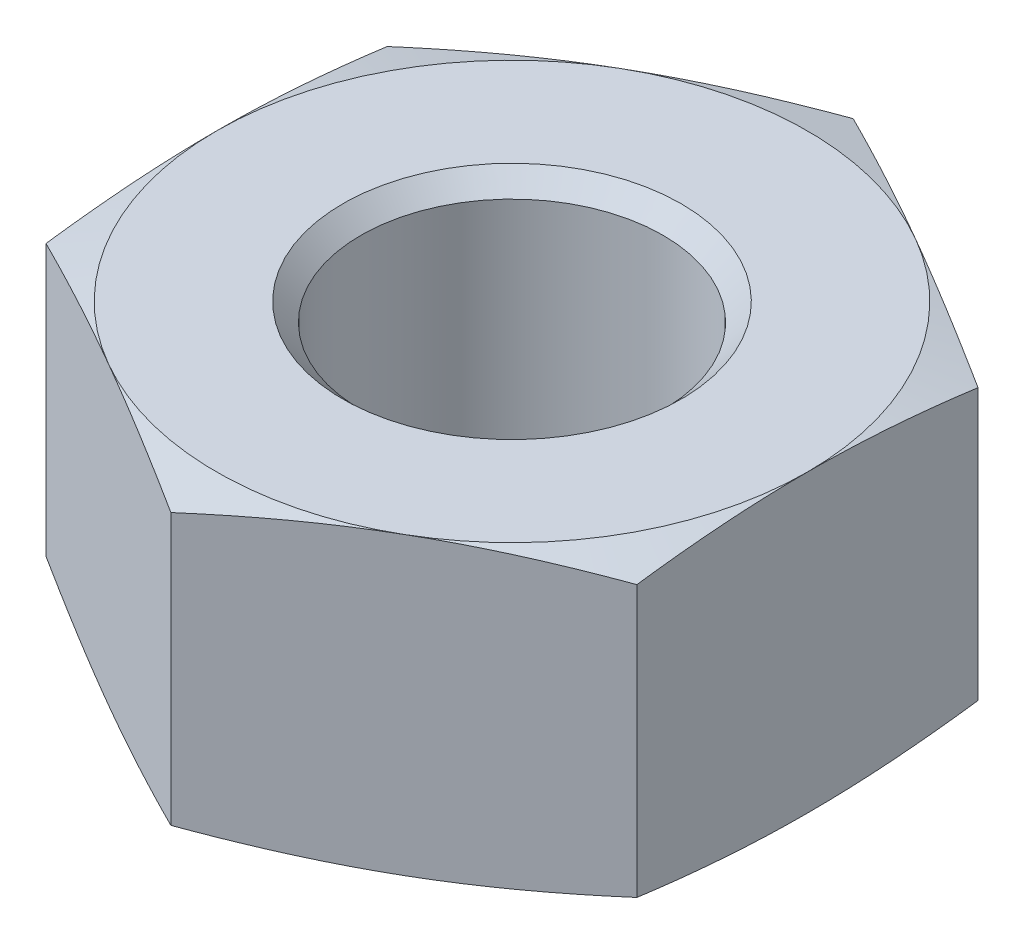
ISO-10303-21;
HEADER;
FILE_DESCRIPTION(('STEP AP214'),'2;1');
FILE_NAME('part.step','',(''),(''),'','','');
FILE_SCHEMA(('AUTOMOTIVE_DESIGN { 1 0 10303 214 1 1 1 1 }'));
ENDSEC;
DATA;
#1=APPLICATION_CONTEXT('core data for automotive mechanical design processes');
#2=APPLICATION_PROTOCOL_DEFINITION('international standard','automotive_design',2000,#1);
#3=PRODUCT_CONTEXT('',#1,'mechanical');
#4=PRODUCT('Part','Part','',(#3));
#5=PRODUCT_RELATED_PRODUCT_CATEGORY('part','',(#4));
#6=PRODUCT_DEFINITION_FORMATION('','',#4);
#7=PRODUCT_DEFINITION_CONTEXT('part definition',#1,'design');
#8=PRODUCT_DEFINITION('design','',#6,#7);
#9=PRODUCT_DEFINITION_SHAPE('','',#8);
#10=(LENGTH_UNIT() NAMED_UNIT(*) SI_UNIT(.MILLI.,.METRE.));
#11=(NAMED_UNIT(*) PLANE_ANGLE_UNIT() SI_UNIT($,.RADIAN.));
#12=(NAMED_UNIT(*) SI_UNIT($,.STERADIAN.) SOLID_ANGLE_UNIT());
#13=UNCERTAINTY_MEASURE_WITH_UNIT(LENGTH_MEASURE(1.E-05),#10,'distance_accuracy_value','');
#14=(GEOMETRIC_REPRESENTATION_CONTEXT(3) GLOBAL_UNCERTAINTY_ASSIGNED_CONTEXT((#13)) GLOBAL_UNIT_ASSIGNED_CONTEXT((#10,
#11,#12)) REPRESENTATION_CONTEXT('',''));
#15=CARTESIAN_POINT('',(0.,0.,0.));
#16=DIRECTION('',(0.,0.,1.));
#17=DIRECTION('',(1.,0.,0.));
#18=AXIS2_PLACEMENT_3D('',#15,#16,#17);
#19=CARTESIAN_POINT('',(-6.5,6.5,-3.7527767497326));
#20=DIRECTION('',(1.,0.,0.));
#21=DIRECTION('',(0.,0.,-1.));
#22=AXIS2_PLACEMENT_3D('',#19,#20,#21);
#23=PLANE('',#22);
#24=DIRECTION('',(0.,-1.,0.));
#25=VECTOR('',#24,1.);
#26=CARTESIAN_POINT('',(-6.5,6.23056275187204,-3.7527767497326));
#27=LINE('',#26,#25);
#28=CARTESIAN_POINT('',(-6.5,6.23056275187204,-3.7527767497326));
#29=VERTEX_POINT('',#28);
#30=CARTESIAN_POINT('',(-6.5,0.269437248127976,-3.7527767497326));
#31=VERTEX_POINT('',#30);
#32=EDGE_CURVE('E118',#29,#31,#27,.T.);
#33=ORIENTED_EDGE('',*,*,#32,.T.);
#34=CARTESIAN_POINT('',(-6.5,0.269437247496808,-3.75277674502149));
#35=CARTESIAN_POINT('',(-6.5,0.186247582676988,-3.13184063289249));
#36=CARTESIAN_POINT('',(-6.5,0.118430458271947,-2.51052770723897));
#37=CARTESIAN_POINT('',(-6.5,0.0250099618368206,-1.25843438548893));
#38=CARTESIAN_POINT('',(-6.5,1.60932633538891E-07,-0.629074333512159));
#39=CARTESIAN_POINT('',(-6.5,7.92768628521401E-13,-6.2059061175547E-06));
#40=B_SPLINE_CURVE_WITH_KNOTS('',3,(#34,#35,#36,#37,#38,#39),.UNSPECIFIED.,.F.,.F.,(4,2,4),
(7.68274920144655,9.56079556300664,11.4388419245667),.UNSPECIFIED.);
#41=CARTESIAN_POINT('',(-6.5,0.,0.));
#42=VERTEX_POINT('',#41);
#43=EDGE_CURVE('E106',#31,#42,#40,.T.);
#44=ORIENTED_EDGE('',*,*,#43,.T.);
#45=CARTESIAN_POINT('',(-6.5,7.92768628521401E-13,-6.2059061175547E-06));
#46=CARTESIAN_POINT('',(-6.5,-1.64350637266164E-07,0.642428790685808));
#47=CARTESIAN_POINT('',(-6.5,0.0258917321915124,1.28237667353398));
#48=CARTESIAN_POINT('',(-6.5,0.12112865915791,2.53441211538354));
#49=CARTESIAN_POINT('',(-6.5,0.188020683808513,3.14507520983443));
#50=CARTESIAN_POINT('',(-6.5,0.269437214303708,3.75277649726482));
#51=B_SPLINE_CURVE_WITH_KNOTS('',3,(#45,#46,#47,#48,#49,#50),.UNSPECIFIED.,.F.,.F.,(4,2,4),
(11.4388419245667,13.3393255442372,15.145068658514),.UNSPECIFIED.);
#52=CARTESIAN_POINT('',(-6.5,0.269437248127976,3.7527767497326));
#53=VERTEX_POINT('',#52);
#54=EDGE_CURVE('E119',#42,#53,#51,.T.);
#55=ORIENTED_EDGE('',*,*,#54,.T.);
#56=DIRECTION('',(0.,-1.,0.));
#57=VECTOR('',#56,1.);
#58=CARTESIAN_POINT('',(-6.5,6.23056275187204,3.7527767497326));
#59=LINE('',#58,#57);
#60=CARTESIAN_POINT('',(-6.5,6.23056275187204,3.7527767497326));
#61=VERTEX_POINT('',#60);
#62=EDGE_CURVE('E178',#61,#53,#59,.T.);
#63=ORIENTED_EDGE('',*,*,#62,.F.);
#64=CARTESIAN_POINT('',(-6.5,6.23056275250321,3.75277674502149));
#65=CARTESIAN_POINT('',(-6.5,6.31375241732302,3.13184063289249));
#66=CARTESIAN_POINT('',(-6.5,6.38156954172806,2.51052770723897));
#67=CARTESIAN_POINT('',(-6.5,6.47499003816318,1.25843438548892));
#68=CARTESIAN_POINT('',(-6.5,6.49999983906737,0.629074333512159));
#69=CARTESIAN_POINT('',(-6.5,6.49999999999921,6.2059061175547E-06));
#70=B_SPLINE_CURVE_WITH_KNOTS('',3,(#64,#65,#66,#67,#68,#69),.UNSPECIFIED.,.F.,.F.,(4,2,4),
(7.68274920144654,9.56079556300663,11.4388419245667),.UNSPECIFIED.);
#71=CARTESIAN_POINT('',(-6.5,6.5,0.));
#72=VERTEX_POINT('',#71);
#73=EDGE_CURVE('E179',#61,#72,#70,.T.);
#74=ORIENTED_EDGE('',*,*,#73,.T.);
#75=CARTESIAN_POINT('',(-6.5,6.49999999999921,6.2059061175547E-06));
#76=CARTESIAN_POINT('',(-6.5,6.50000016435064,-0.6424287906858));
#77=CARTESIAN_POINT('',(-6.5,6.47410826780849,-1.28237667353396));
#78=CARTESIAN_POINT('',(-6.5,6.3788713408421,-2.53441211538353));
#79=CARTESIAN_POINT('',(-6.5,6.3119793161915,-3.14507520983443));
#80=CARTESIAN_POINT('',(-6.5,6.23056278569631,-3.75277649726482));
#81=B_SPLINE_CURVE_WITH_KNOTS('',3,(#75,#76,#77,#78,#79,#80),.UNSPECIFIED.,.F.,.F.,(4,2,4),
(11.4388419245667,13.3393255442372,15.145068658514),.UNSPECIFIED.);
#82=EDGE_CURVE('E140',#72,#29,#81,.T.);
#83=ORIENTED_EDGE('',*,*,#82,.T.);
#84=EDGE_LOOP('',(#33,#44,#55,#63,#74,#83));
#85=FACE_BOUND('',#84,.T.);
#86=ADVANCED_FACE('F16',(#85),#23,.F.);
#87=CARTESIAN_POINT('',(0.,6.5,-7.5055534994651));
#88=DIRECTION('',(0.499999999999993,0.,0.866025403784443));
#89=DIRECTION('',(0.866025403784443,0.,-0.499999999999993));
#90=AXIS2_PLACEMENT_3D('',#87,#88,#89);
#91=PLANE('',#90);
#92=DIRECTION('',(0.,-1.,0.));
#93=VECTOR('',#92,1.);
#94=CARTESIAN_POINT('',(0.,6.23056275187205,-7.5055534994651));
#95=LINE('',#94,#93);
#96=CARTESIAN_POINT('',(0.,6.23056275187205,-7.5055534994651));
#97=VERTEX_POINT('',#96);
#98=CARTESIAN_POINT('',(0.,0.269437248127962,-7.5055534994651));
#99=VERTEX_POINT('',#98);
#100=EDGE_CURVE('E950',#97,#99,#95,.T.);
#101=ORIENTED_EDGE('',*,*,#100,.T.);
#102=CARTESIAN_POINT('',(2.71278907560055E-11,0.269437248132159,-7.50555349948076));
#103=CARTESIAN_POINT('',(-0.539862573707489,0.185920217324084,-7.19386369720968));
#104=CARTESIAN_POINT('',(-1.08219002556647,0.11771398970998,-6.88075079688998));
#105=CARTESIAN_POINT('',(-2.16655805869418,0.0246286602462401,-6.25469062106309));
#106=CARTESIAN_POINT('',(-2.70734569501004,0.,-5.94246673366171));
#107=CARTESIAN_POINT('',(-3.24999999999995,0.,-5.62916512459888));
#108=B_SPLINE_CURVE_WITH_KNOTS('',3,(#102,#103,#104,#105,#106,#107),.UNSPECIFIED.,.F.,.F.,(4,2,
4),(0.000230940107676686,1.87661931497392,3.75300768984017),.UNSPECIFIED.);
#109=CARTESIAN_POINT('',(-3.24999999999996,0.,-5.62916512459888));
#110=VERTEX_POINT('',#109);
#111=EDGE_CURVE('E127',#99,#110,#108,.T.);
#112=ORIENTED_EDGE('',*,*,#111,.T.);
#113=CARTESIAN_POINT('',(-3.24999999999995,0.,-5.62916512459888));
#114=CARTESIAN_POINT('',(-3.79265430498988,0.,-5.31586351553604));
#115=CARTESIAN_POINT('',(-4.33344194130576,0.0246286602462419,-5.00363962813465));
#116=CARTESIAN_POINT('',(-5.4178099744335,0.117713989709988,-4.37757945230774));
#117=CARTESIAN_POINT('',(-5.9601374262925,0.185920217324094,-4.06446655198803));
#118=CARTESIAN_POINT('',(-6.50000000002713,0.269437248132174,-3.75277674971694));
#119=B_SPLINE_CURVE_WITH_KNOTS('',3,(#113,#114,#115,#116,#117,#118),.UNSPECIFIED.,.F.,.F.,(4,2,
4),(3.75300768984017,5.62939606470648,7.50578443957278),.UNSPECIFIED.);
#120=EDGE_CURVE('E109',#110,#31,#119,.T.);
#121=ORIENTED_EDGE('',*,*,#120,.T.);
#122=ORIENTED_EDGE('',*,*,#32,.F.);
#123=CARTESIAN_POINT('',(-6.50000000002713,6.23056275186784,-3.75277674971694));
#124=CARTESIAN_POINT('',(-5.9601374262925,6.31407978267591,-4.06446655198803));
#125=CARTESIAN_POINT('',(-5.4178099744335,6.38228601029002,-4.37757945230774));
#126=CARTESIAN_POINT('',(-4.33344194130576,6.47537133975376,-5.00363962813465));
#127=CARTESIAN_POINT('',(-3.79265430498988,6.5,-5.31586351553604));
#128=CARTESIAN_POINT('',(-3.24999999999996,6.5,-5.62916512459888));
#129=B_SPLINE_CURVE_WITH_KNOTS('',3,(#123,#124,#125,#126,#127,#128),.UNSPECIFIED.,.F.,.F.,(4,2,
4),(0.000230940107674785,1.87661931497398,3.75300768984028),.UNSPECIFIED.);
#130=CARTESIAN_POINT('',(-3.24999999999996,6.5,-5.62916512459888));
#131=VERTEX_POINT('',#130);
#132=EDGE_CURVE('E131',#29,#131,#129,.T.);
#133=ORIENTED_EDGE('',*,*,#132,.T.);
#134=CARTESIAN_POINT('',(-3.24999999999996,6.5,-5.62916512459888));
#135=CARTESIAN_POINT('',(-2.70734569501005,6.5,-5.94246673366171));
#136=CARTESIAN_POINT('',(-2.16655805869418,6.47537133975376,-6.25469062106309));
#137=CARTESIAN_POINT('',(-1.08219002556647,6.38228601029003,-6.88075079688998));
#138=CARTESIAN_POINT('',(-0.53986257370749,6.31407978267592,-7.19386369720968));
#139=CARTESIAN_POINT('',(2.71265572878577E-11,6.23056275186785,-7.50555349948076));
#140=B_SPLINE_CURVE_WITH_KNOTS('',3,(#134,#135,#136,#137,#138,#139),.UNSPECIFIED.,.F.,.F.,(4,2,
4),(3.75300768984028,5.62939606470653,7.50578443957278),.UNSPECIFIED.);
#141=EDGE_CURVE('E499',#131,#97,#140,.T.);
#142=ORIENTED_EDGE('',*,*,#141,.T.);
#143=EDGE_LOOP('',(#101,#112,#121,#122,#133,#142));
#144=FACE_BOUND('',#143,.T.);
#145=ADVANCED_FACE('F126',(#144),#91,.F.);
#146=CARTESIAN_POINT('',(6.5,6.5,-3.7527767497326));
#147=DIRECTION('',(-0.499999999999993,0.,0.866025403784443));
#148=DIRECTION('',(0.866025403784443,0.,0.499999999999993));
#149=AXIS2_PLACEMENT_3D('',#146,#147,#148);
#150=PLANE('',#149);
#151=DIRECTION('',(0.,-1.,0.));
#152=VECTOR('',#151,1.);
#153=CARTESIAN_POINT('',(6.5,6.23056275187204,-3.7527767497326));
#154=LINE('',#153,#152);
#155=CARTESIAN_POINT('',(6.5,6.23056275187204,-3.7527767497326));
#156=VERTEX_POINT('',#155);
#157=CARTESIAN_POINT('',(6.5,0.269437248127976,-3.7527767497326));
#158=VERTEX_POINT('',#157);
#159=EDGE_CURVE('E368',#156,#158,#154,.T.);
#160=ORIENTED_EDGE('',*,*,#159,.T.);
#161=CARTESIAN_POINT('',(6.50000000002713,0.269437248132172,-3.75277674971694));
#162=CARTESIAN_POINT('',(5.9601374262925,0.185920217324093,-4.06446655198803));
#163=CARTESIAN_POINT('',(5.4178099744335,0.117713989709987,-4.37757945230774));
#164=CARTESIAN_POINT('',(4.33344194130576,0.024628660246241,-5.00363962813465));
#165=CARTESIAN_POINT('',(3.79265430498988,0.,-5.31586351553604));
#166=CARTESIAN_POINT('',(3.24999999999995,0.,-5.62916512459887));
#167=B_SPLINE_CURVE_WITH_KNOTS('',3,(#161,#162,#163,#164,#165,#166),.UNSPECIFIED.,.F.,.F.,(4,2,
4),(0.000230940107674785,1.87661931497398,3.75300768984028),.UNSPECIFIED.);
#168=CARTESIAN_POINT('',(3.24999999999996,0.,-5.62916512459888));
#169=VERTEX_POINT('',#168);
#170=EDGE_CURVE('E493',#158,#169,#167,.T.);
#171=ORIENTED_EDGE('',*,*,#170,.T.);
#172=CARTESIAN_POINT('',(3.24999999999995,0.,-5.62916512459887));
#173=CARTESIAN_POINT('',(2.70734569501004,0.,-5.9424667336617));
#174=CARTESIAN_POINT('',(2.16655805869417,0.0246286602462401,-6.25469062106309));
#175=CARTESIAN_POINT('',(1.08219002556647,0.11771398970998,-6.88075079688998));
#176=CARTESIAN_POINT('',(0.539862573707485,0.185920217324083,-7.19386369720968));
#177=CARTESIAN_POINT('',(-2.71310751642773E-11,0.269437248132158,-7.50555349948076));
#178=B_SPLINE_CURVE_WITH_KNOTS('',3,(#172,#173,#174,#175,#176,#177),.UNSPECIFIED.,.F.,.F.,(4,2,
4),(3.75300768984028,5.62939606470653,7.50578443957278),.UNSPECIFIED.);
#179=EDGE_CURVE('E482',#169,#99,#178,.T.);
#180=ORIENTED_EDGE('',*,*,#179,.T.);
#181=ORIENTED_EDGE('',*,*,#100,.F.);
#182=CARTESIAN_POINT('',(-2.71310751642773E-11,6.23056275186785,-7.50555349948076));
#183=CARTESIAN_POINT('',(0.539862573707486,6.31407978267592,-7.19386369720968));
#184=CARTESIAN_POINT('',(1.08219002556647,6.38228601029003,-6.88075079688998));
#185=CARTESIAN_POINT('',(2.16655805869417,6.47537133975376,-6.25469062106309));
#186=CARTESIAN_POINT('',(2.70734569501004,6.5,-5.94246673366171));
#187=CARTESIAN_POINT('',(3.24999999999995,6.5,-5.62916512459888));
#188=B_SPLINE_CURVE_WITH_KNOTS('',3,(#182,#183,#184,#185,#186,#187),.UNSPECIFIED.,.F.,.F.,(4,2,
4),(0.000230940107676547,1.87661931497392,3.75300768984017),.UNSPECIFIED.);
#189=CARTESIAN_POINT('',(3.24999999999996,6.5,-5.62916512459888));
#190=VERTEX_POINT('',#189);
#191=EDGE_CURVE('E312',#97,#190,#188,.T.);
#192=ORIENTED_EDGE('',*,*,#191,.T.);
#193=CARTESIAN_POINT('',(3.24999999999995,6.5,-5.62916512459888));
#194=CARTESIAN_POINT('',(3.79265430498988,6.5,-5.31586351553604));
#195=CARTESIAN_POINT('',(4.33344194130576,6.47537133975376,-5.00363962813465));
#196=CARTESIAN_POINT('',(5.4178099744335,6.38228601029002,-4.37757945230774));
#197=CARTESIAN_POINT('',(5.9601374262925,6.31407978267592,-4.06446655198803));
#198=CARTESIAN_POINT('',(6.50000000002713,6.23056275186784,-3.75277674971694));
#199=B_SPLINE_CURVE_WITH_KNOTS('',3,(#193,#194,#195,#196,#197,#198),.UNSPECIFIED.,.F.,.F.,(4,2,
4),(3.75300768984017,5.62939606470648,7.50578443957278),.UNSPECIFIED.);
#200=EDGE_CURVE('E315',#190,#156,#199,.T.);
#201=ORIENTED_EDGE('',*,*,#200,.T.);
#202=EDGE_LOOP('',(#160,#171,#180,#181,#192,#201));
#203=FACE_BOUND('',#202,.T.);
#204=ADVANCED_FACE('F336',(#203),#150,.F.);
#205=CARTESIAN_POINT('',(6.5,6.5,3.7527767497326));
#206=DIRECTION('',(-1.,0.,0.));
#207=DIRECTION('',(0.,0.,1.));
#208=AXIS2_PLACEMENT_3D('',#205,#206,#207);
#209=PLANE('',#208);
#210=DIRECTION('',(0.,-1.,0.));
#211=VECTOR('',#210,1.);
#212=CARTESIAN_POINT('',(6.5,6.23056275187204,3.7527767497326));
#213=LINE('',#212,#211);
#214=CARTESIAN_POINT('',(6.5,6.23056275187204,3.7527767497326));
#215=VERTEX_POINT('',#214);
#216=CARTESIAN_POINT('',(6.5,0.269437248127976,3.7527767497326));
#217=VERTEX_POINT('',#216);
#218=EDGE_CURVE('E293',#215,#217,#213,.T.);
#219=ORIENTED_EDGE('',*,*,#218,.T.);
#220=CARTESIAN_POINT('',(6.5,0.269437247496808,3.75277674502149));
#221=CARTESIAN_POINT('',(6.5,0.186247582676988,3.13184063289249));
#222=CARTESIAN_POINT('',(6.5,0.118430458271946,2.51052770723897));
#223=CARTESIAN_POINT('',(6.5,0.0250099618368214,1.25843438548893));
#224=CARTESIAN_POINT('',(6.5,1.60932633538891E-07,0.629074333512159));
#225=CARTESIAN_POINT('',(6.5,7.92768628521401E-13,6.2059061175547E-06));
#226=B_SPLINE_CURVE_WITH_KNOTS('',3,(#220,#221,#222,#223,#224,#225),.UNSPECIFIED.,.F.,.F.,(4,2,
4),(7.68274920144655,9.56079556300664,11.4388419245667),.UNSPECIFIED.);
#227=CARTESIAN_POINT('',(6.5,0.,0.));
#228=VERTEX_POINT('',#227);
#229=EDGE_CURVE('E284',#217,#228,#226,.T.);
#230=ORIENTED_EDGE('',*,*,#229,.T.);
#231=CARTESIAN_POINT('',(6.5,7.92768628521401E-13,6.2059061175547E-06));
#232=CARTESIAN_POINT('',(6.5,-1.64350637266164E-07,-0.642428790685808));
#233=CARTESIAN_POINT('',(6.5,0.0258917321915133,-1.28237667353398));
#234=CARTESIAN_POINT('',(6.5,0.12112865915791,-2.53441211538354));
#235=CARTESIAN_POINT('',(6.5,0.188020683808513,-3.14507520983443));
#236=CARTESIAN_POINT('',(6.5,0.269437214303708,-3.75277649726483));
#237=B_SPLINE_CURVE_WITH_KNOTS('',3,(#231,#232,#233,#234,#235,#236),.UNSPECIFIED.,.F.,.F.,(4,2,
4),(11.4388419245667,13.3393255442372,15.145068658514),.UNSPECIFIED.);
#238=EDGE_CURVE('E291',#228,#158,#237,.T.);
#239=ORIENTED_EDGE('',*,*,#238,.T.);
#240=ORIENTED_EDGE('',*,*,#159,.F.);
#241=CARTESIAN_POINT('',(6.5,6.23056275250321,-3.75277674502149));
#242=CARTESIAN_POINT('',(6.5,6.31375241732302,-3.13184063289249));
#243=CARTESIAN_POINT('',(6.5,6.38156954172806,-2.51052770723897));
#244=CARTESIAN_POINT('',(6.5,6.47499003816318,-1.25843438548893));
#245=CARTESIAN_POINT('',(6.5,6.49999983906737,-0.629074333512159));
#246=CARTESIAN_POINT('',(6.5,6.49999999999921,-6.2059061175547E-06));
#247=B_SPLINE_CURVE_WITH_KNOTS('',3,(#241,#242,#243,#244,#245,#246),.UNSPECIFIED.,.F.,.F.,(4,2,
4),(7.68274920144654,9.56079556300663,11.4388419245667),.UNSPECIFIED.);
#248=CARTESIAN_POINT('',(6.5,6.5,0.));
#249=VERTEX_POINT('',#248);
#250=EDGE_CURVE('E360',#156,#249,#247,.T.);
#251=ORIENTED_EDGE('',*,*,#250,.T.);
#252=CARTESIAN_POINT('',(6.5,6.49999999999921,-6.2059061175547E-06));
#253=CARTESIAN_POINT('',(6.5,6.50000016435064,0.642428790685801));
#254=CARTESIAN_POINT('',(6.5,6.47410826780849,1.28237667353396));
#255=CARTESIAN_POINT('',(6.5,6.3788713408421,2.53441211538353));
#256=CARTESIAN_POINT('',(6.5,6.3119793161915,3.14507520983443));
#257=CARTESIAN_POINT('',(6.5,6.23056278569631,3.75277649726482));
#258=B_SPLINE_CURVE_WITH_KNOTS('',3,(#252,#253,#254,#255,#256,#257),.UNSPECIFIED.,.F.,.F.,(4,2,
4),(11.4388419245667,13.3393255442372,15.145068658514),.UNSPECIFIED.);
#259=EDGE_CURVE('E309',#249,#215,#258,.T.);
#260=ORIENTED_EDGE('',*,*,#259,.T.);
#261=EDGE_LOOP('',(#219,#230,#239,#240,#251,#260));
#262=FACE_BOUND('',#261,.T.);
#263=ADVANCED_FACE('F307',(#262),#209,.F.);
#264=CARTESIAN_POINT('',(0.,6.5,7.5055534994651));
#265=DIRECTION('',(-0.499999999999993,0.,-0.866025403784443));
#266=DIRECTION('',(-0.866025403784443,0.,0.499999999999993));
#267=AXIS2_PLACEMENT_3D('',#264,#265,#266);
#268=PLANE('',#267);
#269=DIRECTION('',(0.,-1.,0.));
#270=VECTOR('',#269,1.);
#271=CARTESIAN_POINT('',(0.,6.23056275187205,7.5055534994651));
#272=LINE('',#271,#270);
#273=CARTESIAN_POINT('',(0.,6.23056275187205,7.5055534994651));
#274=VERTEX_POINT('',#273);
#275=CARTESIAN_POINT('',(0.,0.269437248127962,7.5055534994651));
#276=VERTEX_POINT('',#275);
#277=EDGE_CURVE('E380',#274,#276,#272,.T.);
#278=ORIENTED_EDGE('',*,*,#277,.T.);
#279=CARTESIAN_POINT('',(-2.71281388674178E-11,0.26943724813216,7.50555349948076));
#280=CARTESIAN_POINT('',(0.539862573707489,0.185920217324085,7.19386369720968));
#281=CARTESIAN_POINT('',(1.08219002556647,0.117713989709983,6.88075079688998));
#282=CARTESIAN_POINT('',(2.16655805869418,0.0246286602462401,6.25469062106309));
#283=CARTESIAN_POINT('',(2.70734569501004,0.,5.94246673366171));
#284=CARTESIAN_POINT('',(3.24999999999996,0.,5.62916512459888));
#285=B_SPLINE_CURVE_WITH_KNOTS('',3,(#279,#280,#281,#282,#283,#284),.UNSPECIFIED.,.F.,.F.,(4,2,
4),(0.0002309401076767,1.87661931497392,3.75300768984017),.UNSPECIFIED.);
#286=CARTESIAN_POINT('',(3.24999999999996,0.,5.62916512459888));
#287=VERTEX_POINT('',#286);
#288=EDGE_CURVE('E302',#276,#287,#285,.T.);
#289=ORIENTED_EDGE('',*,*,#288,.T.);
#290=CARTESIAN_POINT('',(3.24999999999996,0.,5.62916512459888));
#291=CARTESIAN_POINT('',(3.79265430498988,0.,5.31586351553604));
#292=CARTESIAN_POINT('',(4.33344194130576,0.0246286602462419,5.00363962813465));
#293=CARTESIAN_POINT('',(5.4178099744335,0.117713989709988,4.37757945230774));
#294=CARTESIAN_POINT('',(5.9601374262925,0.185920217324094,4.06446655198803));
#295=CARTESIAN_POINT('',(6.50000000002713,0.269437248132174,3.75277674971694));
#296=B_SPLINE_CURVE_WITH_KNOTS('',3,(#290,#291,#292,#293,#294,#295),.UNSPECIFIED.,.F.,.F.,(4,2,
4),(3.75300768984017,5.62939606470648,7.50578443957278),.UNSPECIFIED.);
#297=EDGE_CURVE('E289',#287,#217,#296,.T.);
#298=ORIENTED_EDGE('',*,*,#297,.T.);
#299=ORIENTED_EDGE('',*,*,#218,.F.);
#300=CARTESIAN_POINT('',(6.50000000002713,6.23056275186784,3.75277674971694));
#301=CARTESIAN_POINT('',(5.9601374262925,6.31407978267591,4.06446655198803));
#302=CARTESIAN_POINT('',(5.4178099744335,6.38228601029002,4.37757945230774));
#303=CARTESIAN_POINT('',(4.33344194130576,6.47537133975376,5.00363962813465));
#304=CARTESIAN_POINT('',(3.79265430498988,6.5,5.31586351553604));
#305=CARTESIAN_POINT('',(3.24999999999996,6.5,5.62916512459888));
#306=B_SPLINE_CURVE_WITH_KNOTS('',3,(#300,#301,#302,#303,#304,#305),.UNSPECIFIED.,.F.,.F.,(4,2,
4),(0.000230940107674785,1.87661931497398,3.75300768984028),.UNSPECIFIED.);
#307=CARTESIAN_POINT('',(3.24999999999996,6.5,5.62916512459888));
#308=VERTEX_POINT('',#307);
#309=EDGE_CURVE('E304',#215,#308,#306,.T.);
#310=ORIENTED_EDGE('',*,*,#309,.T.);
#311=CARTESIAN_POINT('',(3.24999999999996,6.5,5.62916512459888));
#312=CARTESIAN_POINT('',(2.70734569501004,6.5,5.94246673366171));
#313=CARTESIAN_POINT('',(2.16655805869418,6.47537133975376,6.25469062106309));
#314=CARTESIAN_POINT('',(1.08219002556647,6.38228601029003,6.88075079688998));
#315=CARTESIAN_POINT('',(0.53986257370749,6.31407978267592,7.19386369720968));
#316=CARTESIAN_POINT('',(-2.71274414807561E-11,6.23056275186785,7.50555349948076));
#317=B_SPLINE_CURVE_WITH_KNOTS('',3,(#311,#312,#313,#314,#315,#316),.UNSPECIFIED.,.F.,.F.,(4,2,
4),(3.75300768984028,5.62939606470653,7.50578443957278),.UNSPECIFIED.);
#318=EDGE_CURVE('E600',#308,#274,#317,.T.);
#319=ORIENTED_EDGE('',*,*,#318,.T.);
#320=EDGE_LOOP('',(#278,#289,#298,#299,#310,#319));
#321=FACE_BOUND('',#320,.T.);
#322=ADVANCED_FACE('F298',(#321),#268,.F.);
#323=CARTESIAN_POINT('',(-6.5,6.5,3.7527767497326));
#324=DIRECTION('',(0.499999999999993,0.,-0.866025403784443));
#325=DIRECTION('',(-0.866025403784443,0.,-0.499999999999993));
#326=AXIS2_PLACEMENT_3D('',#323,#324,#325);
#327=PLANE('',#326);
#328=ORIENTED_EDGE('',*,*,#62,.T.);
#329=CARTESIAN_POINT('',(-6.50000000002713,0.269437248132173,3.75277674971694));
#330=CARTESIAN_POINT('',(-5.9601374262925,0.185920217324094,4.06446655198803));
#331=CARTESIAN_POINT('',(-5.4178099744335,0.117713989709987,4.37757945230774));
#332=CARTESIAN_POINT('',(-4.33344194130576,0.024628660246241,5.00363962813465));
#333=CARTESIAN_POINT('',(-3.79265430498988,0.,5.31586351553604));
#334=CARTESIAN_POINT('',(-3.24999999999995,0.,5.62916512459888));
#335=B_SPLINE_CURVE_WITH_KNOTS('',3,(#329,#330,#331,#332,#333,#334),.UNSPECIFIED.,.F.,.F.,(4,2,
4),(0.000230940107674785,1.87661931497398,3.75300768984028),.UNSPECIFIED.);
#336=CARTESIAN_POINT('',(-3.24999999999996,0.,5.62916512459888));
#337=VERTEX_POINT('',#336);
#338=EDGE_CURVE('E193',#53,#337,#335,.T.);
#339=ORIENTED_EDGE('',*,*,#338,.T.);
#340=CARTESIAN_POINT('',(-3.24999999999995,0.,5.62916512459888));
#341=CARTESIAN_POINT('',(-2.70734569501004,0.,5.9424667336617));
#342=CARTESIAN_POINT('',(-2.16655805869418,0.0246286602462384,6.25469062106308));
#343=CARTESIAN_POINT('',(-1.08219002556647,0.11771398970998,6.88075079688998));
#344=CARTESIAN_POINT('',(-0.539862573707488,0.185920217324083,7.19386369720968));
#345=CARTESIAN_POINT('',(2.71284730790633E-11,0.269437248132158,7.50555349948076));
#346=B_SPLINE_CURVE_WITH_KNOTS('',3,(#340,#341,#342,#343,#344,#345),.UNSPECIFIED.,.F.,.F.,(4,2,
4),(3.75300768984028,5.62939606470653,7.50578443957278),.UNSPECIFIED.);
#347=EDGE_CURVE('E577',#337,#276,#346,.T.);
#348=ORIENTED_EDGE('',*,*,#347,.T.);
#349=ORIENTED_EDGE('',*,*,#277,.F.);
#350=CARTESIAN_POINT('',(2.71310751642773E-11,6.23056275186786,7.50555349948076));
#351=CARTESIAN_POINT('',(-0.539862573707485,6.31407978267593,7.19386369720968));
#352=CARTESIAN_POINT('',(-1.08219002556647,6.38228601029003,6.88075079688998));
#353=CARTESIAN_POINT('',(-2.16655805869417,6.47537133975376,6.25469062106309));
#354=CARTESIAN_POINT('',(-2.70734569501004,6.5,5.9424667336617));
#355=CARTESIAN_POINT('',(-3.24999999999995,6.5,5.62916512459888));
#356=B_SPLINE_CURVE_WITH_KNOTS('',3,(#350,#351,#352,#353,#354,#355),.UNSPECIFIED.,.F.,.F.,(4,2,
4),(0.000230940107676547,1.87661931497392,3.75300768984017),.UNSPECIFIED.);
#357=CARTESIAN_POINT('',(-3.24999999999996,6.5,5.62916512459888));
#358=VERTEX_POINT('',#357);
#359=EDGE_CURVE('E539',#274,#358,#356,.T.);
#360=ORIENTED_EDGE('',*,*,#359,.T.);
#361=CARTESIAN_POINT('',(-3.24999999999995,6.5,5.62916512459888));
#362=CARTESIAN_POINT('',(-3.79265430498988,6.5,5.31586351553604));
#363=CARTESIAN_POINT('',(-4.33344194130576,6.47537133975376,5.00363962813465));
#364=CARTESIAN_POINT('',(-5.4178099744335,6.38228601029002,4.37757945230774));
#365=CARTESIAN_POINT('',(-5.9601374262925,6.31407978267592,4.06446655198803));
#366=CARTESIAN_POINT('',(-6.50000000002713,6.23056275186784,3.75277674971694));
#367=B_SPLINE_CURVE_WITH_KNOTS('',3,(#361,#362,#363,#364,#365,#366),.UNSPECIFIED.,.F.,.F.,(4,2,
4),(3.75300768984017,5.62939606470648,7.50578443957278),.UNSPECIFIED.);
#368=EDGE_CURVE('E538',#358,#61,#367,.T.);
#369=ORIENTED_EDGE('',*,*,#368,.T.);
#370=EDGE_LOOP('',(#328,#339,#348,#349,#360,#369));
#371=FACE_BOUND('',#370,.T.);
#372=ADVANCED_FACE('F399',(#371),#327,.F.);
#373=CARTESIAN_POINT('',(0.,6.5,0.));
#374=DIRECTION('',(0.,-1.,0.));
#375=DIRECTION('',(0.,0.,-1.));
#376=AXIS2_PLACEMENT_3D('',#373,#374,#375);
#377=CONICAL_SURFACE('',#376,6.5,1.30899693899576);
#378=CARTESIAN_POINT('',(0.,6.5,0.));
#379=DIRECTION('',(0.,1.,0.));
#380=DIRECTION('',(0.499999999999994,0.,-0.866025403784442));
#381=AXIS2_PLACEMENT_3D('',#378,#379,#380);
#382=CIRCLE('',#381,6.5);
#383=EDGE_CURVE('E526',#190,#131,#382,.T.);
#384=ORIENTED_EDGE('',*,*,#383,.F.);
#385=ORIENTED_EDGE('',*,*,#191,.F.);
#386=ORIENTED_EDGE('',*,*,#141,.F.);
#387=EDGE_LOOP('',(#384,#385,#386));
#388=FACE_BOUND('',#387,.T.);
#389=ADVANCED_FACE('F390',(#388),#377,.T.);
#390=CARTESIAN_POINT('',(0.,6.5,0.));
#391=DIRECTION('',(0.,-1.,0.));
#392=DIRECTION('',(0.499999999999993,0.,-0.866025403784443));
#393=AXIS2_PLACEMENT_3D('',#390,#391,#392);
#394=CIRCLE('',#393,6.5);
#395=EDGE_CURVE('E458',#190,#249,#394,.T.);
#396=ORIENTED_EDGE('',*,*,#395,.T.);
#397=ORIENTED_EDGE('',*,*,#250,.F.);
#398=ORIENTED_EDGE('',*,*,#200,.F.);
#399=EDGE_LOOP('',(#396,#397,#398));
#400=FACE_BOUND('',#399,.T.);
#401=ADVANCED_FACE('F395',(#400),#377,.T.);
#402=CARTESIAN_POINT('',(0.,6.5,0.));
#403=DIRECTION('',(0.,1.,0.));
#404=DIRECTION('',(0.499999999999993,0.,0.866025403784443));
#405=AXIS2_PLACEMENT_3D('',#402,#403,#404);
#406=CIRCLE('',#405,6.5);
#407=EDGE_CURVE('E374',#308,#249,#406,.T.);
#408=ORIENTED_EDGE('',*,*,#407,.F.);
#409=ORIENTED_EDGE('',*,*,#309,.F.);
#410=ORIENTED_EDGE('',*,*,#259,.F.);
#411=EDGE_LOOP('',(#408,#409,#410));
#412=FACE_BOUND('',#411,.T.);
#413=ADVANCED_FACE('F372',(#412),#377,.T.);
#414=CARTESIAN_POINT('',(0.,6.5,0.));
#415=DIRECTION('',(0.,1.,0.));
#416=DIRECTION('',(-0.499999999999993,0.,0.866025403784443));
#417=AXIS2_PLACEMENT_3D('',#414,#415,#416);
#418=CIRCLE('',#417,6.5);
#419=EDGE_CURVE('E384',#358,#308,#418,.T.);
#420=ORIENTED_EDGE('',*,*,#419,.F.);
#421=ORIENTED_EDGE('',*,*,#359,.F.);
#422=ORIENTED_EDGE('',*,*,#318,.F.);
#423=EDGE_LOOP('',(#420,#421,#422));
#424=FACE_BOUND('',#423,.T.);
#425=ADVANCED_FACE('F613',(#424),#377,.T.);
#426=ORIENTED_EDGE('',*,*,#368,.F.);
#427=CARTESIAN_POINT('',(0.,6.5,0.));
#428=DIRECTION('',(0.,1.,0.));
#429=DIRECTION('',(-1.,0.,0.));
#430=AXIS2_PLACEMENT_3D('',#427,#428,#429);
#431=CIRCLE('',#430,6.5);
#432=EDGE_CURVE('E33',#72,#358,#431,.T.);
#433=ORIENTED_EDGE('',*,*,#432,.F.);
#434=ORIENTED_EDGE('',*,*,#73,.F.);
#435=EDGE_LOOP('',(#426,#433,#434));
#436=FACE_BOUND('',#435,.T.);
#437=ADVANCED_FACE('F625',(#436),#377,.T.);
#438=CARTESIAN_POINT('',(0.,6.5,0.));
#439=DIRECTION('',(0.,1.,0.));
#440=DIRECTION('',(-0.499999999999993,0.,-0.866025403784443));
#441=AXIS2_PLACEMENT_3D('',#438,#439,#440);
#442=CIRCLE('',#441,6.5);
#443=EDGE_CURVE('E619',#131,#72,#442,.T.);
#444=ORIENTED_EDGE('',*,*,#443,.F.);
#445=ORIENTED_EDGE('',*,*,#132,.F.);
#446=ORIENTED_EDGE('',*,*,#82,.F.);
#447=EDGE_LOOP('',(#444,#445,#446));
#448=FACE_BOUND('',#447,.T.);
#449=ADVANCED_FACE('F400',(#448),#377,.T.);
#450=CARTESIAN_POINT('',(0.,6.5,0.));
#451=DIRECTION('',(0.,-1.,0.));
#452=DIRECTION('',(0.,0.,-1.));
#453=AXIS2_PLACEMENT_3D('',#450,#451,#452);
#454=PLANE('',#453);
#455=CARTESIAN_POINT('',(0.,6.5,0.));
#456=DIRECTION('',(0.,-1.,0.));
#457=DIRECTION('',(0.,0.,-1.));
#458=AXIS2_PLACEMENT_3D('',#455,#456,#457);
#459=CIRCLE('',#458,3.7235);
#460=CARTESIAN_POINT('',(0.,6.5,-3.7235));
#461=VERTEX_POINT('',#460);
#462=EDGE_CURVE('E616',#461,#461,#459,.T.);
#463=ORIENTED_EDGE('',*,*,#462,.T.);
#464=EDGE_LOOP('',(#463));
#465=FACE_BOUND('',#464,.T.);
#466=ORIENTED_EDGE('',*,*,#383,.T.);
#467=ORIENTED_EDGE('',*,*,#443,.T.);
#468=ORIENTED_EDGE('',*,*,#432,.T.);
#469=ORIENTED_EDGE('',*,*,#419,.T.);
#470=ORIENTED_EDGE('',*,*,#407,.T.);
#471=ORIENTED_EDGE('',*,*,#395,.F.);
#472=EDGE_LOOP('',(#466,#467,#468,#469,#470,#471));
#473=FACE_BOUND('',#472,.T.);
#474=ADVANCED_FACE('F220',(#465,#473),#454,.F.);
#475=CARTESIAN_POINT('',(0.,0.870834875401148,0.));
#476=DIRECTION('',(0.,1.,0.));
#477=DIRECTION('',(0.,0.,1.));
#478=AXIS2_PLACEMENT_3D('',#475,#476,#477);
#479=CONICAL_SURFACE('',#478,9.75,1.30899693899575);
#480=ORIENTED_EDGE('',*,*,#347,.F.);
#481=CARTESIAN_POINT('',(0.,0.,0.));
#482=DIRECTION('',(0.,-1.,0.));
#483=DIRECTION('',(0.499999999999993,0.,0.866025403784443));
#484=AXIS2_PLACEMENT_3D('',#481,#482,#483);
#485=CIRCLE('',#484,6.50000000000001);
#486=EDGE_CURVE('E39',#287,#337,#485,.T.);
#487=ORIENTED_EDGE('',*,*,#486,.F.);
#488=ORIENTED_EDGE('',*,*,#288,.F.);
#489=EDGE_LOOP('',(#480,#487,#488));
#490=FACE_BOUND('',#489,.T.);
#491=ADVANCED_FACE('F210',(#490),#479,.T.);
#492=CARTESIAN_POINT('',(0.,0.,0.));
#493=DIRECTION('',(0.,-1.,0.));
#494=DIRECTION('',(-0.499999999999993,0.,0.866025403784443));
#495=AXIS2_PLACEMENT_3D('',#492,#493,#494);
#496=CIRCLE('',#495,6.50000000000001);
#497=EDGE_CURVE('E191',#337,#42,#496,.T.);
#498=ORIENTED_EDGE('',*,*,#497,.F.);
#499=ORIENTED_EDGE('',*,*,#338,.F.);
#500=ORIENTED_EDGE('',*,*,#54,.F.);
#501=EDGE_LOOP('',(#498,#499,#500));
#502=FACE_BOUND('',#501,.T.);
#503=ADVANCED_FACE('F194',(#502),#479,.T.);
#504=ORIENTED_EDGE('',*,*,#297,.F.);
#505=CARTESIAN_POINT('',(0.,0.,0.));
#506=DIRECTION('',(0.,-1.,0.));
#507=DIRECTION('',(1.,0.,0.));
#508=AXIS2_PLACEMENT_3D('',#505,#506,#507);
#509=CIRCLE('',#508,6.50000000000001);
#510=EDGE_CURVE('E271',#228,#287,#509,.T.);
#511=ORIENTED_EDGE('',*,*,#510,.F.);
#512=ORIENTED_EDGE('',*,*,#229,.F.);
#513=EDGE_LOOP('',(#504,#511,#512));
#514=FACE_BOUND('',#513,.T.);
#515=ADVANCED_FACE('F285',(#514),#479,.T.);
#516=ORIENTED_EDGE('',*,*,#238,.F.);
#517=CARTESIAN_POINT('',(0.,0.,0.));
#518=DIRECTION('',(0.,-1.,0.));
#519=DIRECTION('',(0.499999999999993,0.,-0.866025403784443));
#520=AXIS2_PLACEMENT_3D('',#517,#518,#519);
#521=CIRCLE('',#520,6.50000000000001);
#522=EDGE_CURVE('E279',#169,#228,#521,.T.);
#523=ORIENTED_EDGE('',*,*,#522,.F.);
#524=ORIENTED_EDGE('',*,*,#170,.F.);
#525=EDGE_LOOP('',(#516,#523,#524));
#526=FACE_BOUND('',#525,.T.);
#527=ADVANCED_FACE('F766',(#526),#479,.T.);
#528=CARTESIAN_POINT('',(0.,0.,0.));
#529=DIRECTION('',(0.,-1.,0.));
#530=DIRECTION('',(-0.499999999999994,0.,-0.866025403784442));
#531=AXIS2_PLACEMENT_3D('',#528,#529,#530);
#532=CIRCLE('',#531,6.50000000000001);
#533=EDGE_CURVE('E942',#110,#169,#532,.T.);
#534=ORIENTED_EDGE('',*,*,#533,.F.);
#535=ORIENTED_EDGE('',*,*,#111,.F.);
#536=ORIENTED_EDGE('',*,*,#179,.F.);
#537=EDGE_LOOP('',(#534,#535,#536));
#538=FACE_BOUND('',#537,.T.);
#539=ADVANCED_FACE('F773',(#538),#479,.T.);
#540=CARTESIAN_POINT('',(0.,0.,0.));
#541=DIRECTION('',(0.,-1.,0.));
#542=DIRECTION('',(-1.,0.,0.));
#543=AXIS2_PLACEMENT_3D('',#540,#541,#542);
#544=CIRCLE('',#543,6.50000000000001);
#545=EDGE_CURVE('E115',#42,#110,#544,.T.);
#546=ORIENTED_EDGE('',*,*,#545,.F.);
#547=ORIENTED_EDGE('',*,*,#43,.F.);
#548=ORIENTED_EDGE('',*,*,#120,.F.);
#549=EDGE_LOOP('',(#546,#547,#548));
#550=FACE_BOUND('',#549,.T.);
#551=ADVANCED_FACE('F108',(#550),#479,.T.);
#552=CARTESIAN_POINT('',(7.8,0.,0.));
#553=DIRECTION('',(0.,1.,0.));
#554=DIRECTION('',(0.,0.,1.));
#555=AXIS2_PLACEMENT_3D('',#552,#553,#554);
#556=PLANE('',#555);
#557=CARTESIAN_POINT('',(0.,0.,0.));
#558=DIRECTION('',(0.,-1.,0.));
#559=DIRECTION('',(0.,0.,-1.));
#560=AXIS2_PLACEMENT_3D('',#557,#558,#559);
#561=CIRCLE('',#560,4.);
#562=CARTESIAN_POINT('',(0.,0.,-4.));
#563=VERTEX_POINT('',#562);
#564=EDGE_CURVE('E940',#563,#563,#561,.T.);
#565=ORIENTED_EDGE('',*,*,#564,.F.);
#566=EDGE_LOOP('',(#565));
#567=FACE_BOUND('',#566,.T.);
#568=ORIENTED_EDGE('',*,*,#486,.T.);
#569=ORIENTED_EDGE('',*,*,#497,.T.);
#570=ORIENTED_EDGE('',*,*,#545,.T.);
#571=ORIENTED_EDGE('',*,*,#533,.T.);
#572=ORIENTED_EDGE('',*,*,#522,.T.);
#573=ORIENTED_EDGE('',*,*,#510,.T.);
#574=EDGE_LOOP('',(#568,#569,#570,#571,#572,#573));
#575=FACE_BOUND('',#574,.T.);
#576=ADVANCED_FACE('F219',(#567,#575),#556,.F.);
#577=CARTESIAN_POINT('',(0.,6.5,0.));
#578=DIRECTION('',(0.,1.,0.));
#579=DIRECTION('',(0.,0.,1.));
#580=AXIS2_PLACEMENT_3D('',#577,#578,#579);
#581=CONICAL_SURFACE('',#580,3.7235,0.785398163397448);
#582=CARTESIAN_POINT('',(0.,6.1,0.));
#583=DIRECTION('',(0.,-1.,0.));
#584=DIRECTION('',(0.,0.,-1.));
#585=AXIS2_PLACEMENT_3D('',#582,#583,#584);
#586=CIRCLE('',#585,3.3235);
#587=CARTESIAN_POINT('',(0.,6.1,-3.3235));
#588=VERTEX_POINT('',#587);
#589=EDGE_CURVE('E24',#588,#588,#586,.T.);
#590=ORIENTED_EDGE('',*,*,#589,.T.);
#591=EDGE_LOOP('',(#590));
#592=FACE_BOUND('',#591,.T.);
#593=ORIENTED_EDGE('',*,*,#462,.F.);
#594=EDGE_LOOP('',(#593));
#595=FACE_BOUND('',#594,.T.);
#596=ADVANCED_FACE('F802',(#592,#595),#581,.F.);
#597=CARTESIAN_POINT('',(0.,0.,0.));
#598=DIRECTION('',(0.,-1.,0.));
#599=DIRECTION('',(0.,0.,-1.));
#600=AXIS2_PLACEMENT_3D('',#597,#598,#599);
#601=CYLINDRICAL_SURFACE('',#600,3.3235);
#602=CARTESIAN_POINT('',(0.,0.6765,0.));
#603=DIRECTION('',(0.,-1.,0.));
#604=DIRECTION('',(0.,0.,-1.));
#605=AXIS2_PLACEMENT_3D('',#602,#603,#604);
#606=CIRCLE('',#605,3.3235);
#607=CARTESIAN_POINT('',(0.,0.6765,-3.3235));
#608=VERTEX_POINT('',#607);
#609=EDGE_CURVE('E11',#608,#608,#606,.T.);
#610=ORIENTED_EDGE('',*,*,#609,.T.);
#611=EDGE_LOOP('',(#610));
#612=FACE_BOUND('',#611,.T.);
#613=ORIENTED_EDGE('',*,*,#589,.F.);
#614=EDGE_LOOP('',(#613));
#615=FACE_BOUND('',#614,.T.);
#616=ADVANCED_FACE('F815',(#612,#615),#601,.F.);
#617=CARTESIAN_POINT('',(0.,0.6765,0.));
#618=DIRECTION('',(0.,-1.,0.));
#619=DIRECTION('',(0.,0.,-1.));
#620=AXIS2_PLACEMENT_3D('',#617,#618,#619);
#621=CONICAL_SURFACE('',#620,3.3235,0.785398163397448);
#622=ORIENTED_EDGE('',*,*,#564,.T.);
#623=EDGE_LOOP('',(#622));
#624=FACE_BOUND('',#623,.T.);
#625=ORIENTED_EDGE('',*,*,#609,.F.);
#626=EDGE_LOOP('',(#625));
#627=FACE_BOUND('',#626,.T.);
#628=ADVANCED_FACE('F18',(#624,#627),#621,.F.);
#629=CLOSED_SHELL('',(#86,#145,#204,#263,#322,#372,#389,#401,#413,#425,#437,#449,#474,#491,#503,
#515,#527,#539,#551,#576,#596,#616,#628));
#630=MANIFOLD_SOLID_BREP('B1',#629);
#631=ADVANCED_BREP_SHAPE_REPRESENTATION('',(#18,#630),#14);
#632=SHAPE_DEFINITION_REPRESENTATION(#9,#631);
ENDSEC;
END-ISO-10303-21;
